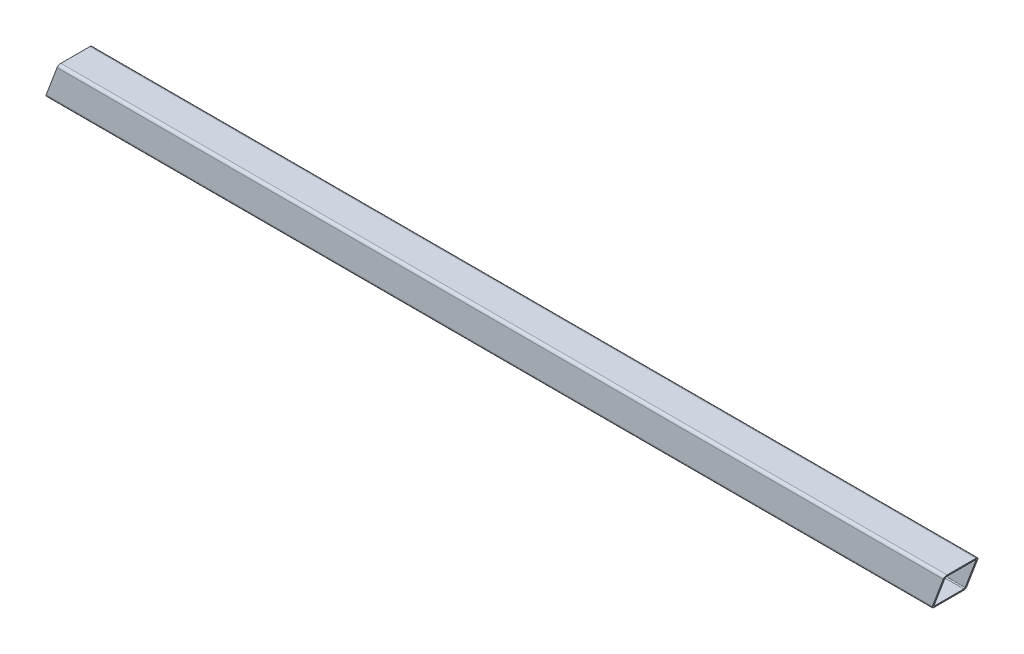
ISO-10303-21;
HEADER;
FILE_DESCRIPTION(('STEP AP214'),'2;1');
FILE_NAME('part.step','',(''),(''),'','','');
FILE_SCHEMA(('AUTOMOTIVE_DESIGN { 1 0 10303 214 1 1 1 1 }'));
ENDSEC;
DATA;
#1=APPLICATION_CONTEXT('core data for automotive mechanical design processes');
#2=APPLICATION_PROTOCOL_DEFINITION('international standard','automotive_design',2000,#1);
#3=PRODUCT_CONTEXT('',#1,'mechanical');
#4=PRODUCT('Part','Part','',(#3));
#5=PRODUCT_RELATED_PRODUCT_CATEGORY('part','',(#4));
#6=PRODUCT_DEFINITION_FORMATION('','',#4);
#7=PRODUCT_DEFINITION_CONTEXT('part definition',#1,'design');
#8=PRODUCT_DEFINITION('design','',#6,#7);
#9=PRODUCT_DEFINITION_SHAPE('','',#8);
#10=(LENGTH_UNIT() NAMED_UNIT(*) SI_UNIT(.MILLI.,.METRE.));
#11=(NAMED_UNIT(*) PLANE_ANGLE_UNIT() SI_UNIT($,.RADIAN.));
#12=(NAMED_UNIT(*) SI_UNIT($,.STERADIAN.) SOLID_ANGLE_UNIT());
#13=UNCERTAINTY_MEASURE_WITH_UNIT(LENGTH_MEASURE(1.E-05),#10,'distance_accuracy_value','');
#14=(GEOMETRIC_REPRESENTATION_CONTEXT(3) GLOBAL_UNCERTAINTY_ASSIGNED_CONTEXT((#13)) GLOBAL_UNIT_ASSIGNED_CONTEXT((#10,
#11,#12)) REPRESENTATION_CONTEXT('',''));
#15=CARTESIAN_POINT('',(0.,0.,0.));
#16=DIRECTION('',(0.,0.,1.));
#17=DIRECTION('',(1.,0.,0.));
#18=AXIS2_PLACEMENT_3D('',#15,#16,#17);
#19=CARTESIAN_POINT('',(1320.8,10.541,21.209));
#20=DIRECTION('',(-1.,0.,0.));
#21=DIRECTION('',(0.,0.,1.));
#22=AXIS2_PLACEMENT_3D('',#19,#20,#21);
#23=CYLINDRICAL_SURFACE('',#22,1.016);
#24=DIRECTION('',(-1.,0.,0.));
#25=VECTOR('',#24,1.);
#26=CARTESIAN_POINT('',(1320.8,9.525,21.209));
#27=LINE('',#26,#25);
#28=CARTESIAN_POINT('',(1217.31572696019,9.52500000000011,21.209));
#29=VERTEX_POINT('',#28);
#30=CARTESIAN_POINT('',(891.922323591974,9.525,21.209));
#31=VERTEX_POINT('',#30);
#32=EDGE_CURVE('E171',#29,#31,#27,.T.);
#33=ORIENTED_EDGE('',*,*,#32,.F.);
#34=CARTESIAN_POINT('',(1217.69546117946,10.541,21.209));
#35=DIRECTION('',(-0.936712289938725,0.350100108365806,0.));
#36=DIRECTION('',(-0.350100108365806,-0.936712289938725,0.));
#37=AXIS2_PLACEMENT_3D('',#34,#35,#36);
#38=ELLIPSE('',#37,1.08464467789407,1.016);
#39=CARTESIAN_POINT('',(1217.69546117946,10.541,22.225));
#40=VERTEX_POINT('',#39);
#41=EDGE_CURVE('E159',#29,#40,#38,.T.);
#42=ORIENTED_EDGE('',*,*,#41,.T.);
#43=DIRECTION('',(-1.,0.,0.));
#44=VECTOR('',#43,1.);
#45=CARTESIAN_POINT('',(1320.8,10.541,22.225));
#46=LINE('',#45,#44);
#47=CARTESIAN_POINT('',(892.302057811243,10.541,22.225));
#48=VERTEX_POINT('',#47);
#49=EDGE_CURVE('E169',#40,#48,#46,.T.);
#50=ORIENTED_EDGE('',*,*,#49,.T.);
#51=CARTESIAN_POINT('',(892.302057811243,10.541,21.209));
#52=DIRECTION('',(0.936712289938726,-0.350100108365804,0.));
#53=DIRECTION('',(-0.350100108365804,-0.936712289938726,0.));
#54=AXIS2_PLACEMENT_3D('',#51,#52,#53);
#55=ELLIPSE('',#54,1.08464467789406,1.016);
#56=EDGE_CURVE('E178',#48,#31,#55,.T.);
#57=ORIENTED_EDGE('',*,*,#56,.T.);
#58=EDGE_LOOP('',(#33,#42,#50,#57));
#59=FACE_BOUND('',#58,.T.);
#60=ADVANCED_FACE('F47',(#59),#23,.T.);
#61=CARTESIAN_POINT('',(1320.8,9.525,21.209));
#62=DIRECTION('',(0.,1.,0.));
#63=DIRECTION('',(0.,0.,1.));
#64=AXIS2_PLACEMENT_3D('',#61,#62,#63);
#65=PLANE('',#64);
#66=DIRECTION('',(-1.,0.,0.));
#67=VECTOR('',#66,1.);
#68=CARTESIAN_POINT('',(1320.8,9.525,10.541));
#69=LINE('',#68,#67);
#70=CARTESIAN_POINT('',(1217.31572696019,9.52500000000011,10.541));
#71=VERTEX_POINT('',#70);
#72=CARTESIAN_POINT('',(891.922323591974,9.525,10.541));
#73=VERTEX_POINT('',#72);
#74=EDGE_CURVE('E246',#71,#73,#69,.T.);
#75=ORIENTED_EDGE('',*,*,#74,.F.);
#76=DIRECTION('',(0.,0.,1.));
#77=VECTOR('',#76,1.);
#78=CARTESIAN_POINT('',(1217.31572696019,9.52500000000011,9.52499999999999));
#79=LINE('',#78,#77);
#80=EDGE_CURVE('E266',#71,#29,#79,.T.);
#81=ORIENTED_EDGE('',*,*,#80,.T.);
#82=ORIENTED_EDGE('',*,*,#32,.T.);
#83=DIRECTION('',(0.,0.,1.));
#84=VECTOR('',#83,1.);
#85=CARTESIAN_POINT('',(891.922323591974,9.525,9.52499999999999));
#86=LINE('',#85,#84);
#87=EDGE_CURVE('E55',#73,#31,#86,.T.);
#88=ORIENTED_EDGE('',*,*,#87,.F.);
#89=EDGE_LOOP('',(#75,#81,#82,#88));
#90=FACE_BOUND('',#89,.T.);
#91=ADVANCED_FACE('F265',(#90),#65,.F.);
#92=CARTESIAN_POINT('',(1320.8,10.541,10.541));
#93=DIRECTION('',(-1.,0.,0.));
#94=DIRECTION('',(0.,0.,1.));
#95=AXIS2_PLACEMENT_3D('',#92,#93,#94);
#96=CYLINDRICAL_SURFACE('',#95,1.016);
#97=DIRECTION('',(-1.,0.,0.));
#98=VECTOR('',#97,1.);
#99=CARTESIAN_POINT('',(1320.8,10.541,9.52499999999999));
#100=LINE('',#99,#98);
#101=CARTESIAN_POINT('',(1217.69546117946,10.541,9.52499999999999));
#102=VERTEX_POINT('',#101);
#103=CARTESIAN_POINT('',(892.302057811243,10.541,9.52499999999999));
#104=VERTEX_POINT('',#103);
#105=EDGE_CURVE('E244',#102,#104,#100,.T.);
#106=ORIENTED_EDGE('',*,*,#105,.F.);
#107=CARTESIAN_POINT('',(1217.69546117946,10.541,10.541));
#108=DIRECTION('',(-0.936712289938725,0.350100108365806,0.));
#109=DIRECTION('',(-0.350100108365806,-0.936712289938725,0.));
#110=AXIS2_PLACEMENT_3D('',#107,#108,#109);
#111=ELLIPSE('',#110,1.08464467789406,1.016);
#112=EDGE_CURVE('E172',#102,#71,#111,.T.);
#113=ORIENTED_EDGE('',*,*,#112,.T.);
#114=ORIENTED_EDGE('',*,*,#74,.T.);
#115=CARTESIAN_POINT('',(892.302057811243,10.541,10.541));
#116=DIRECTION('',(0.936712289938726,-0.350100108365804,0.));
#117=DIRECTION('',(-0.350100108365804,-0.936712289938726,0.));
#118=AXIS2_PLACEMENT_3D('',#115,#116,#117);
#119=ELLIPSE('',#118,1.08464467789406,1.016);
#120=EDGE_CURVE('E248',#73,#104,#119,.T.);
#121=ORIENTED_EDGE('',*,*,#120,.T.);
#122=EDGE_LOOP('',(#106,#113,#114,#121));
#123=FACE_BOUND('',#122,.T.);
#124=ADVANCED_FACE('F303',(#123),#96,.T.);
#125=CARTESIAN_POINT('',(1320.8,10.541,9.52499999999999));
#126=DIRECTION('',(0.,0.,1.));
#127=DIRECTION('',(1.,0.,0.));
#128=AXIS2_PLACEMENT_3D('',#125,#126,#127);
#129=PLANE('',#128);
#130=DIRECTION('',(-1.,0.,0.));
#131=VECTOR('',#130,1.);
#132=CARTESIAN_POINT('',(1320.8,21.209,9.52499999999999));
#133=LINE('',#132,#131);
#134=CARTESIAN_POINT('',(1221.68267048179,21.209,9.52499999999999));
#135=VERTEX_POINT('',#134);
#136=CARTESIAN_POINT('',(896.289267113568,21.209,9.52499999999999));
#137=VERTEX_POINT('',#136);
#138=EDGE_CURVE('E243',#135,#137,#133,.T.);
#139=ORIENTED_EDGE('',*,*,#138,.F.);
#140=DIRECTION('',(-0.350100108365806,-0.936712289938725,0.));
#141=VECTOR('',#140,1.);
#142=CARTESIAN_POINT('',(1222.06240470106,22.225,9.52499999999999));
#143=LINE('',#142,#141);
#144=EDGE_CURVE('E164',#135,#102,#143,.T.);
#145=ORIENTED_EDGE('',*,*,#144,.T.);
#146=ORIENTED_EDGE('',*,*,#105,.T.);
#147=DIRECTION('',(0.350100108365804,0.936712289938726,0.));
#148=VECTOR('',#147,1.);
#149=CARTESIAN_POINT('',(896.669001332837,22.225,9.52499999999999));
#150=LINE('',#149,#148);
#151=EDGE_CURVE('E240',#104,#137,#150,.T.);
#152=ORIENTED_EDGE('',*,*,#151,.T.);
#153=EDGE_LOOP('',(#139,#145,#146,#152));
#154=FACE_BOUND('',#153,.T.);
#155=ADVANCED_FACE('F300',(#154),#129,.F.);
#156=CARTESIAN_POINT('',(1320.8,21.209,10.541));
#157=DIRECTION('',(-1.,0.,0.));
#158=DIRECTION('',(0.,0.,1.));
#159=AXIS2_PLACEMENT_3D('',#156,#157,#158);
#160=CYLINDRICAL_SURFACE('',#159,1.016);
#161=DIRECTION('',(-1.,0.,0.));
#162=VECTOR('',#161,1.);
#163=CARTESIAN_POINT('',(1320.8,22.225,10.541));
#164=LINE('',#163,#162);
#165=CARTESIAN_POINT('',(1222.06240470106,22.225,10.541));
#166=VERTEX_POINT('',#165);
#167=CARTESIAN_POINT('',(896.669001332837,22.225,10.541));
#168=VERTEX_POINT('',#167);
#169=EDGE_CURVE('E238',#166,#168,#164,.T.);
#170=ORIENTED_EDGE('',*,*,#169,.F.);
#171=CARTESIAN_POINT('',(1221.68267048179,21.209,10.541));
#172=DIRECTION('',(-0.936712289938725,0.350100108365806,0.));
#173=DIRECTION('',(-0.350100108365806,-0.936712289938725,0.));
#174=AXIS2_PLACEMENT_3D('',#171,#172,#173);
#175=ELLIPSE('',#174,1.08464467789406,1.016);
#176=EDGE_CURVE('E288',#166,#135,#175,.T.);
#177=ORIENTED_EDGE('',*,*,#176,.T.);
#178=ORIENTED_EDGE('',*,*,#138,.T.);
#179=CARTESIAN_POINT('',(896.289267113568,21.209,10.541));
#180=DIRECTION('',(0.936712289938726,-0.350100108365804,0.));
#181=DIRECTION('',(-0.350100108365804,-0.936712289938726,0.));
#182=AXIS2_PLACEMENT_3D('',#179,#180,#181);
#183=ELLIPSE('',#182,1.08464467789406,1.016);
#184=EDGE_CURVE('E251',#137,#168,#183,.T.);
#185=ORIENTED_EDGE('',*,*,#184,.T.);
#186=EDGE_LOOP('',(#170,#177,#178,#185));
#187=FACE_BOUND('',#186,.T.);
#188=ADVANCED_FACE('F297',(#187),#160,.T.);
#189=CARTESIAN_POINT('',(1320.8,22.225,10.541));
#190=DIRECTION('',(0.,-1.,0.));
#191=DIRECTION('',(0.,0.,-1.));
#192=AXIS2_PLACEMENT_3D('',#189,#190,#191);
#193=PLANE('',#192);
#194=DIRECTION('',(-1.,0.,0.));
#195=VECTOR('',#194,1.);
#196=CARTESIAN_POINT('',(1320.8,22.225,21.209));
#197=LINE('',#196,#195);
#198=CARTESIAN_POINT('',(1222.06240470106,22.225,21.209));
#199=VERTEX_POINT('',#198);
#200=CARTESIAN_POINT('',(896.669001332837,22.225,21.209));
#201=VERTEX_POINT('',#200);
#202=EDGE_CURVE('E237',#199,#201,#197,.T.);
#203=ORIENTED_EDGE('',*,*,#202,.F.);
#204=DIRECTION('',(0.,0.,1.));
#205=VECTOR('',#204,1.);
#206=CARTESIAN_POINT('',(1222.06240470106,22.225,9.52499999999999));
#207=LINE('',#206,#205);
#208=EDGE_CURVE('E268',#166,#199,#207,.T.);
#209=ORIENTED_EDGE('',*,*,#208,.F.);
#210=ORIENTED_EDGE('',*,*,#169,.T.);
#211=DIRECTION('',(0.,0.,1.));
#212=VECTOR('',#211,1.);
#213=CARTESIAN_POINT('',(896.669001332837,22.225,9.52499999999999));
#214=LINE('',#213,#212);
#215=EDGE_CURVE('E234',#168,#201,#214,.T.);
#216=ORIENTED_EDGE('',*,*,#215,.T.);
#217=EDGE_LOOP('',(#203,#209,#210,#216));
#218=FACE_BOUND('',#217,.T.);
#219=ADVANCED_FACE('F306',(#218),#193,.F.);
#220=CARTESIAN_POINT('',(1320.8,21.209,21.209));
#221=DIRECTION('',(-1.,0.,0.));
#222=DIRECTION('',(0.,0.,1.));
#223=AXIS2_PLACEMENT_3D('',#220,#221,#222);
#224=CYLINDRICAL_SURFACE('',#223,1.016);
#225=DIRECTION('',(-1.,0.,0.));
#226=VECTOR('',#225,1.);
#227=CARTESIAN_POINT('',(1320.8,21.209,22.225));
#228=LINE('',#227,#226);
#229=CARTESIAN_POINT('',(1221.68267048179,21.209,22.225));
#230=VERTEX_POINT('',#229);
#231=CARTESIAN_POINT('',(896.289267113568,21.209,22.225));
#232=VERTEX_POINT('',#231);
#233=EDGE_CURVE('E183',#230,#232,#228,.T.);
#234=ORIENTED_EDGE('',*,*,#233,.F.);
#235=CARTESIAN_POINT('',(1221.68267048179,21.209,21.209));
#236=DIRECTION('',(-0.936712289938725,0.350100108365806,0.));
#237=DIRECTION('',(-0.350100108365806,-0.936712289938725,0.));
#238=AXIS2_PLACEMENT_3D('',#235,#236,#237);
#239=ELLIPSE('',#238,1.08464467789406,1.016);
#240=EDGE_CURVE('E62',#230,#199,#239,.T.);
#241=ORIENTED_EDGE('',*,*,#240,.T.);
#242=ORIENTED_EDGE('',*,*,#202,.T.);
#243=CARTESIAN_POINT('',(896.289267113568,21.209,21.209));
#244=DIRECTION('',(0.936712289938726,-0.350100108365804,0.));
#245=DIRECTION('',(-0.350100108365804,-0.936712289938726,0.));
#246=AXIS2_PLACEMENT_3D('',#243,#244,#245);
#247=ELLIPSE('',#246,1.08464467789406,1.016);
#248=EDGE_CURVE('E214',#201,#232,#247,.T.);
#249=ORIENTED_EDGE('',*,*,#248,.T.);
#250=EDGE_LOOP('',(#234,#241,#242,#249));
#251=FACE_BOUND('',#250,.T.);
#252=ADVANCED_FACE('F308',(#251),#224,.T.);
#253=CARTESIAN_POINT('',(1320.8,21.209,22.225));
#254=DIRECTION('',(0.,0.,-1.));
#255=DIRECTION('',(0.,1.,0.));
#256=AXIS2_PLACEMENT_3D('',#253,#254,#255);
#257=PLANE('',#256);
#258=ORIENTED_EDGE('',*,*,#49,.F.);
#259=DIRECTION('',(-0.350100108365806,-0.936712289938725,0.));
#260=VECTOR('',#259,1.);
#261=CARTESIAN_POINT('',(1222.06240470106,22.225,22.225));
#262=LINE('',#261,#260);
#263=EDGE_CURVE('E156',#230,#40,#262,.T.);
#264=ORIENTED_EDGE('',*,*,#263,.F.);
#265=ORIENTED_EDGE('',*,*,#233,.T.);
#266=DIRECTION('',(0.350100108365804,0.936712289938726,0.));
#267=VECTOR('',#266,1.);
#268=CARTESIAN_POINT('',(896.669001332837,22.225,22.225));
#269=LINE('',#268,#267);
#270=EDGE_CURVE('E177',#48,#232,#269,.T.);
#271=ORIENTED_EDGE('',*,*,#270,.F.);
#272=EDGE_LOOP('',(#258,#264,#265,#271));
#273=FACE_BOUND('',#272,.T.);
#274=ADVANCED_FACE('F175',(#273),#257,.F.);
#275=CARTESIAN_POINT('',(1320.8,10.541,10.541));
#276=DIRECTION('',(-1.,0.,0.));
#277=DIRECTION('',(0.,0.,1.));
#278=AXIS2_PLACEMENT_3D('',#275,#276,#277);
#279=CYLINDRICAL_SURFACE('',#278,0.3556);
#280=CARTESIAN_POINT('',(1217.69546117946,10.541,10.541));
#281=DIRECTION('',(-0.936712289938725,0.350100108365806,0.));
#282=DIRECTION('',(-0.350100108365806,-0.936712289938725,0.));
#283=AXIS2_PLACEMENT_3D('',#280,#281,#282);
#284=ELLIPSE('',#283,0.379625637262923,0.3556);
#285=CARTESIAN_POINT('',(1217.69546117946,10.541,10.1854));
#286=VERTEX_POINT('',#285);
#287=CARTESIAN_POINT('',(1217.56255420272,10.1854,10.541));
#288=VERTEX_POINT('',#287);
#289=EDGE_CURVE('E69',#286,#288,#284,.T.);
#290=ORIENTED_EDGE('',*,*,#289,.F.);
#291=DIRECTION('',(-1.,0.,0.));
#292=VECTOR('',#291,1.);
#293=CARTESIAN_POINT('',(1320.8,10.541,10.1854));
#294=LINE('',#293,#292);
#295=CARTESIAN_POINT('',(892.302057811243,10.541,10.1854));
#296=VERTEX_POINT('',#295);
#297=EDGE_CURVE('E185',#286,#296,#294,.T.);
#298=ORIENTED_EDGE('',*,*,#297,.T.);
#299=CARTESIAN_POINT('',(892.302057811243,10.541,10.541));
#300=DIRECTION('',(0.936712289938726,-0.350100108365804,0.));
#301=DIRECTION('',(-0.350100108365804,-0.936712289938726,0.));
#302=AXIS2_PLACEMENT_3D('',#299,#300,#301);
#303=ELLIPSE('',#302,0.379625637262922,0.3556);
#304=CARTESIAN_POINT('',(892.169150834498,10.1854,10.541));
#305=VERTEX_POINT('',#304);
#306=EDGE_CURVE('E199',#305,#296,#303,.T.);
#307=ORIENTED_EDGE('',*,*,#306,.F.);
#308=DIRECTION('',(-1.,0.,0.));
#309=VECTOR('',#308,1.);
#310=CARTESIAN_POINT('',(1320.8,10.1854,10.541));
#311=LINE('',#310,#309);
#312=EDGE_CURVE('E198',#288,#305,#311,.T.);
#313=ORIENTED_EDGE('',*,*,#312,.F.);
#314=EDGE_LOOP('',(#290,#298,#307,#313));
#315=FACE_BOUND('',#314,.T.);
#316=ADVANCED_FACE('F49',(#315),#279,.F.);
#317=CARTESIAN_POINT('',(1320.8,10.541,10.1854));
#318=DIRECTION('',(0.,0.,1.));
#319=DIRECTION('',(1.,0.,0.));
#320=AXIS2_PLACEMENT_3D('',#317,#318,#319);
#321=PLANE('',#320);
#322=DIRECTION('',(-0.350100108365806,-0.936712289938725,0.));
#323=VECTOR('',#322,1.);
#324=CARTESIAN_POINT('',(1230.33299335708,44.3534194263407,10.1854));
#325=LINE('',#324,#323);
#326=CARTESIAN_POINT('',(1221.68267048179,21.209,10.1854));
#327=VERTEX_POINT('',#326);
#328=EDGE_CURVE('E284',#327,#286,#325,.T.);
#329=ORIENTED_EDGE('',*,*,#328,.F.);
#330=DIRECTION('',(-1.,0.,0.));
#331=VECTOR('',#330,1.);
#332=CARTESIAN_POINT('',(1320.8,21.209,10.1854));
#333=LINE('',#332,#331);
#334=CARTESIAN_POINT('',(896.289267113568,21.209,10.1854));
#335=VERTEX_POINT('',#334);
#336=EDGE_CURVE('E187',#327,#335,#333,.T.);
#337=ORIENTED_EDGE('',*,*,#336,.T.);
#338=DIRECTION('',(0.350100108365804,0.936712289938726,0.));
#339=VECTOR('',#338,1.);
#340=CARTESIAN_POINT('',(944.823087383757,151.063932456237,10.1854));
#341=LINE('',#340,#339);
#342=EDGE_CURVE('E205',#296,#335,#341,.T.);
#343=ORIENTED_EDGE('',*,*,#342,.F.);
#344=ORIENTED_EDGE('',*,*,#297,.F.);
#345=EDGE_LOOP('',(#329,#337,#343,#344));
#346=FACE_BOUND('',#345,.T.);
#347=ADVANCED_FACE('F345',(#346),#321,.T.);
#348=CARTESIAN_POINT('',(1320.8,21.209,10.541));
#349=DIRECTION('',(-1.,0.,0.));
#350=DIRECTION('',(0.,0.,1.));
#351=AXIS2_PLACEMENT_3D('',#348,#349,#350);
#352=CYLINDRICAL_SURFACE('',#351,0.3556);
#353=CARTESIAN_POINT('',(1221.68267048179,21.209,10.541));
#354=DIRECTION('',(-0.936712289938725,0.350100108365806,0.));
#355=DIRECTION('',(-0.350100108365806,-0.936712289938725,0.));
#356=AXIS2_PLACEMENT_3D('',#353,#354,#355);
#357=ELLIPSE('',#356,0.379625637262923,0.3556);
#358=CARTESIAN_POINT('',(1221.81557745853,21.5646,10.541));
#359=VERTEX_POINT('',#358);
#360=EDGE_CURVE('E282',#359,#327,#357,.T.);
#361=ORIENTED_EDGE('',*,*,#360,.F.);
#362=DIRECTION('',(-1.,0.,0.));
#363=VECTOR('',#362,1.);
#364=CARTESIAN_POINT('',(1320.8,21.5646,10.541));
#365=LINE('',#364,#363);
#366=CARTESIAN_POINT('',(896.422174090312,21.5646,10.541));
#367=VERTEX_POINT('',#366);
#368=EDGE_CURVE('E189',#359,#367,#365,.T.);
#369=ORIENTED_EDGE('',*,*,#368,.T.);
#370=CARTESIAN_POINT('',(896.289267113568,21.209,10.541));
#371=DIRECTION('',(0.936712289938726,-0.350100108365804,0.));
#372=DIRECTION('',(-0.350100108365804,-0.936712289938726,0.));
#373=AXIS2_PLACEMENT_3D('',#370,#371,#372);
#374=ELLIPSE('',#373,0.379625637262922,0.3556);
#375=EDGE_CURVE('E211',#335,#367,#374,.T.);
#376=ORIENTED_EDGE('',*,*,#375,.F.);
#377=ORIENTED_EDGE('',*,*,#336,.F.);
#378=EDGE_LOOP('',(#361,#369,#376,#377));
#379=FACE_BOUND('',#378,.T.);
#380=ADVANCED_FACE('F342',(#379),#352,.F.);
#381=CARTESIAN_POINT('',(1320.8,21.5646,10.541));
#382=DIRECTION('',(0.,-1.,0.));
#383=DIRECTION('',(0.,0.,-1.));
#384=AXIS2_PLACEMENT_3D('',#381,#382,#383);
#385=PLANE('',#384);
#386=DIRECTION('',(0.,0.,-1.));
#387=VECTOR('',#386,1.);
#388=CARTESIAN_POINT('',(1221.81557745853,21.5646,10.541));
#389=LINE('',#388,#387);
#390=CARTESIAN_POINT('',(1221.81557745853,21.5646,21.209));
#391=VERTEX_POINT('',#390);
#392=EDGE_CURVE('E280',#391,#359,#389,.T.);
#393=ORIENTED_EDGE('',*,*,#392,.F.);
#394=DIRECTION('',(-1.,0.,0.));
#395=VECTOR('',#394,1.);
#396=CARTESIAN_POINT('',(1320.8,21.5646,21.209));
#397=LINE('',#396,#395);
#398=CARTESIAN_POINT('',(896.422174090312,21.5646,21.209));
#399=VERTEX_POINT('',#398);
#400=EDGE_CURVE('E191',#391,#399,#397,.T.);
#401=ORIENTED_EDGE('',*,*,#400,.T.);
#402=DIRECTION('',(0.,0.,1.));
#403=VECTOR('',#402,1.);
#404=CARTESIAN_POINT('',(896.422174090312,21.5646,10.541));
#405=LINE('',#404,#403);
#406=EDGE_CURVE('E219',#367,#399,#405,.T.);
#407=ORIENTED_EDGE('',*,*,#406,.F.);
#408=ORIENTED_EDGE('',*,*,#368,.F.);
#409=EDGE_LOOP('',(#393,#401,#407,#408));
#410=FACE_BOUND('',#409,.T.);
#411=ADVANCED_FACE('F338',(#410),#385,.T.);
#412=CARTESIAN_POINT('',(1320.8,21.209,21.209));
#413=DIRECTION('',(-1.,0.,0.));
#414=DIRECTION('',(0.,0.,1.));
#415=AXIS2_PLACEMENT_3D('',#412,#413,#414);
#416=CYLINDRICAL_SURFACE('',#415,0.355600000000001);
#417=CARTESIAN_POINT('',(1221.68267048179,21.209,21.209));
#418=DIRECTION('',(-0.936712289938725,0.350100108365806,0.));
#419=DIRECTION('',(-0.350100108365806,-0.936712289938725,0.));
#420=AXIS2_PLACEMENT_3D('',#417,#418,#419);
#421=ELLIPSE('',#420,0.379625637262924,0.355600000000001);
#422=CARTESIAN_POINT('',(1221.68267048179,21.209,21.5646));
#423=VERTEX_POINT('',#422);
#424=EDGE_CURVE('E278',#423,#391,#421,.T.);
#425=ORIENTED_EDGE('',*,*,#424,.F.);
#426=DIRECTION('',(-1.,0.,0.));
#427=VECTOR('',#426,1.);
#428=CARTESIAN_POINT('',(1320.8,21.209,21.5646));
#429=LINE('',#428,#427);
#430=CARTESIAN_POINT('',(896.289267113568,21.209,21.5646));
#431=VERTEX_POINT('',#430);
#432=EDGE_CURVE('E193',#423,#431,#429,.T.);
#433=ORIENTED_EDGE('',*,*,#432,.T.);
#434=CARTESIAN_POINT('',(896.289267113568,21.209,21.209));
#435=DIRECTION('',(0.936712289938726,-0.350100108365804,0.));
#436=DIRECTION('',(-0.350100108365804,-0.936712289938726,0.));
#437=AXIS2_PLACEMENT_3D('',#434,#435,#436);
#438=ELLIPSE('',#437,0.379625637262923,0.355600000000001);
#439=EDGE_CURVE('E222',#399,#431,#438,.T.);
#440=ORIENTED_EDGE('',*,*,#439,.F.);
#441=ORIENTED_EDGE('',*,*,#400,.F.);
#442=EDGE_LOOP('',(#425,#433,#440,#441));
#443=FACE_BOUND('',#442,.T.);
#444=ADVANCED_FACE('F334',(#443),#416,.F.);
#445=CARTESIAN_POINT('',(1320.8,21.209,21.5646));
#446=DIRECTION('',(0.,0.,-1.));
#447=DIRECTION('',(-1.,0.,0.));
#448=AXIS2_PLACEMENT_3D('',#445,#446,#447);
#449=PLANE('',#448);
#450=DIRECTION('',(0.350100108365806,0.936712289938725,0.));
#451=VECTOR('',#450,1.);
#452=CARTESIAN_POINT('',(1233.83149007281,53.7138417501969,21.5646));
#453=LINE('',#452,#451);
#454=CARTESIAN_POINT('',(1217.69546117946,10.541,21.5646));
#455=VERTEX_POINT('',#454);
#456=EDGE_CURVE('E276',#455,#423,#453,.T.);
#457=ORIENTED_EDGE('',*,*,#456,.F.);
#458=DIRECTION('',(-1.,0.,0.));
#459=VECTOR('',#458,1.);
#460=CARTESIAN_POINT('',(1320.8,10.541,21.5646));
#461=LINE('',#460,#459);
#462=CARTESIAN_POINT('',(892.302057811243,10.541,21.5646));
#463=VERTEX_POINT('',#462);
#464=EDGE_CURVE('E195',#455,#463,#461,.T.);
#465=ORIENTED_EDGE('',*,*,#464,.T.);
#466=DIRECTION('',(-0.350100108365804,-0.936712289938726,0.));
#467=VECTOR('',#466,1.);
#468=CARTESIAN_POINT('',(948.321584099484,160.424354780094,21.5646));
#469=LINE('',#468,#467);
#470=EDGE_CURVE('E225',#431,#463,#469,.T.);
#471=ORIENTED_EDGE('',*,*,#470,.F.);
#472=ORIENTED_EDGE('',*,*,#432,.F.);
#473=EDGE_LOOP('',(#457,#465,#471,#472));
#474=FACE_BOUND('',#473,.T.);
#475=ADVANCED_FACE('F330',(#474),#449,.T.);
#476=CARTESIAN_POINT('',(1320.8,10.541,21.209));
#477=DIRECTION('',(-1.,0.,0.));
#478=DIRECTION('',(0.,0.,1.));
#479=AXIS2_PLACEMENT_3D('',#476,#477,#478);
#480=CYLINDRICAL_SURFACE('',#479,0.355600000000003);
#481=CARTESIAN_POINT('',(1217.69546117946,10.541,21.209));
#482=DIRECTION('',(-0.936712289938725,0.350100108365806,0.));
#483=DIRECTION('',(-0.350100108365806,-0.936712289938725,0.));
#484=AXIS2_PLACEMENT_3D('',#481,#482,#483);
#485=ELLIPSE('',#484,0.379625637262925,0.355600000000003);
#486=CARTESIAN_POINT('',(1217.56255420272,10.1854,21.209));
#487=VERTEX_POINT('',#486);
#488=EDGE_CURVE('E270',#487,#455,#485,.T.);
#489=ORIENTED_EDGE('',*,*,#488,.F.);
#490=DIRECTION('',(-1.,0.,0.));
#491=VECTOR('',#490,1.);
#492=CARTESIAN_POINT('',(1320.8,10.1854,21.209));
#493=LINE('',#492,#491);
#494=CARTESIAN_POINT('',(892.169150834498,10.1854,21.209));
#495=VERTEX_POINT('',#494);
#496=EDGE_CURVE('E197',#487,#495,#493,.T.);
#497=ORIENTED_EDGE('',*,*,#496,.T.);
#498=CARTESIAN_POINT('',(892.302057811243,10.541,21.209));
#499=DIRECTION('',(0.936712289938726,-0.350100108365804,0.));
#500=DIRECTION('',(-0.350100108365804,-0.936712289938726,0.));
#501=AXIS2_PLACEMENT_3D('',#498,#499,#500);
#502=ELLIPSE('',#501,0.379625637262925,0.355600000000003);
#503=EDGE_CURVE('E228',#463,#495,#502,.T.);
#504=ORIENTED_EDGE('',*,*,#503,.F.);
#505=ORIENTED_EDGE('',*,*,#464,.F.);
#506=EDGE_LOOP('',(#489,#497,#504,#505));
#507=FACE_BOUND('',#506,.T.);
#508=ADVANCED_FACE('F327',(#507),#480,.F.);
#509=CARTESIAN_POINT('',(1320.8,10.1854,21.209));
#510=DIRECTION('',(0.,1.,0.));
#511=DIRECTION('',(0.,0.,1.));
#512=AXIS2_PLACEMENT_3D('',#509,#510,#511);
#513=PLANE('',#512);
#514=DIRECTION('',(0.,0.,1.));
#515=VECTOR('',#514,1.);
#516=CARTESIAN_POINT('',(1217.56255420272,10.1854,21.209));
#517=LINE('',#516,#515);
#518=EDGE_CURVE('E11',#288,#487,#517,.T.);
#519=ORIENTED_EDGE('',*,*,#518,.F.);
#520=ORIENTED_EDGE('',*,*,#312,.T.);
#521=DIRECTION('',(0.,0.,-1.));
#522=VECTOR('',#521,1.);
#523=CARTESIAN_POINT('',(892.169150834498,10.1854,21.209));
#524=LINE('',#523,#522);
#525=EDGE_CURVE('E231',#495,#305,#524,.T.);
#526=ORIENTED_EDGE('',*,*,#525,.F.);
#527=ORIENTED_EDGE('',*,*,#496,.F.);
#528=EDGE_LOOP('',(#519,#520,#526,#527));
#529=FACE_BOUND('',#528,.T.);
#530=ADVANCED_FACE('F324',(#529),#513,.T.);
#531=CARTESIAN_POINT('',(896.669001332837,22.225,9.52499999999999));
#532=DIRECTION('',(0.936712289938726,-0.350100108365804,0.));
#533=DIRECTION('',(0.350100108365804,0.936712289938726,0.));
#534=AXIS2_PLACEMENT_3D('',#531,#532,#533);
#535=PLANE('',#534);
#536=ORIENTED_EDGE('',*,*,#306,.T.);
#537=ORIENTED_EDGE('',*,*,#342,.T.);
#538=ORIENTED_EDGE('',*,*,#375,.T.);
#539=ORIENTED_EDGE('',*,*,#406,.T.);
#540=ORIENTED_EDGE('',*,*,#439,.T.);
#541=ORIENTED_EDGE('',*,*,#470,.T.);
#542=ORIENTED_EDGE('',*,*,#503,.T.);
#543=ORIENTED_EDGE('',*,*,#525,.T.);
#544=EDGE_LOOP('',(#536,#537,#538,#539,#540,#541,#542,#543));
#545=FACE_BOUND('',#544,.T.);
#546=ORIENTED_EDGE('',*,*,#270,.T.);
#547=ORIENTED_EDGE('',*,*,#248,.F.);
#548=ORIENTED_EDGE('',*,*,#215,.F.);
#549=ORIENTED_EDGE('',*,*,#184,.F.);
#550=ORIENTED_EDGE('',*,*,#151,.F.);
#551=ORIENTED_EDGE('',*,*,#120,.F.);
#552=ORIENTED_EDGE('',*,*,#87,.T.);
#553=ORIENTED_EDGE('',*,*,#56,.F.);
#554=EDGE_LOOP('',(#546,#547,#548,#549,#550,#551,#552,#553));
#555=FACE_BOUND('',#554,.T.);
#556=ADVANCED_FACE('F257',(#545,#555),#535,.F.);
#557=CARTESIAN_POINT('',(1222.06240470106,22.225,9.52499999999999));
#558=DIRECTION('',(-0.936712289938725,0.350100108365806,0.));
#559=DIRECTION('',(-0.350100108365806,-0.936712289938725,0.));
#560=AXIS2_PLACEMENT_3D('',#557,#558,#559);
#561=PLANE('',#560);
#562=ORIENTED_EDGE('',*,*,#289,.T.);
#563=ORIENTED_EDGE('',*,*,#518,.T.);
#564=ORIENTED_EDGE('',*,*,#488,.T.);
#565=ORIENTED_EDGE('',*,*,#456,.T.);
#566=ORIENTED_EDGE('',*,*,#424,.T.);
#567=ORIENTED_EDGE('',*,*,#392,.T.);
#568=ORIENTED_EDGE('',*,*,#360,.T.);
#569=ORIENTED_EDGE('',*,*,#328,.T.);
#570=EDGE_LOOP('',(#562,#563,#564,#565,#566,#567,#568,#569));
#571=FACE_BOUND('',#570,.T.);
#572=ORIENTED_EDGE('',*,*,#80,.F.);
#573=ORIENTED_EDGE('',*,*,#112,.F.);
#574=ORIENTED_EDGE('',*,*,#144,.F.);
#575=ORIENTED_EDGE('',*,*,#176,.F.);
#576=ORIENTED_EDGE('',*,*,#208,.T.);
#577=ORIENTED_EDGE('',*,*,#240,.F.);
#578=ORIENTED_EDGE('',*,*,#263,.T.);
#579=ORIENTED_EDGE('',*,*,#41,.F.);
#580=EDGE_LOOP('',(#572,#573,#574,#575,#576,#577,#578,#579));
#581=FACE_BOUND('',#580,.T.);
#582=ADVANCED_FACE('F158',(#571,#581),#561,.F.);
#583=CLOSED_SHELL('',(#60,#91,#124,#155,#188,#219,#252,#274,#316,#347,#380,#411,#444,#475,#508,
#530,#556,#582));
#584=MANIFOLD_SOLID_BREP('B2',#583);
#585=ADVANCED_BREP_SHAPE_REPRESENTATION('',(#18,#584),#14);
#586=SHAPE_DEFINITION_REPRESENTATION(#9,#585);
ENDSEC;
END-ISO-10303-21;
